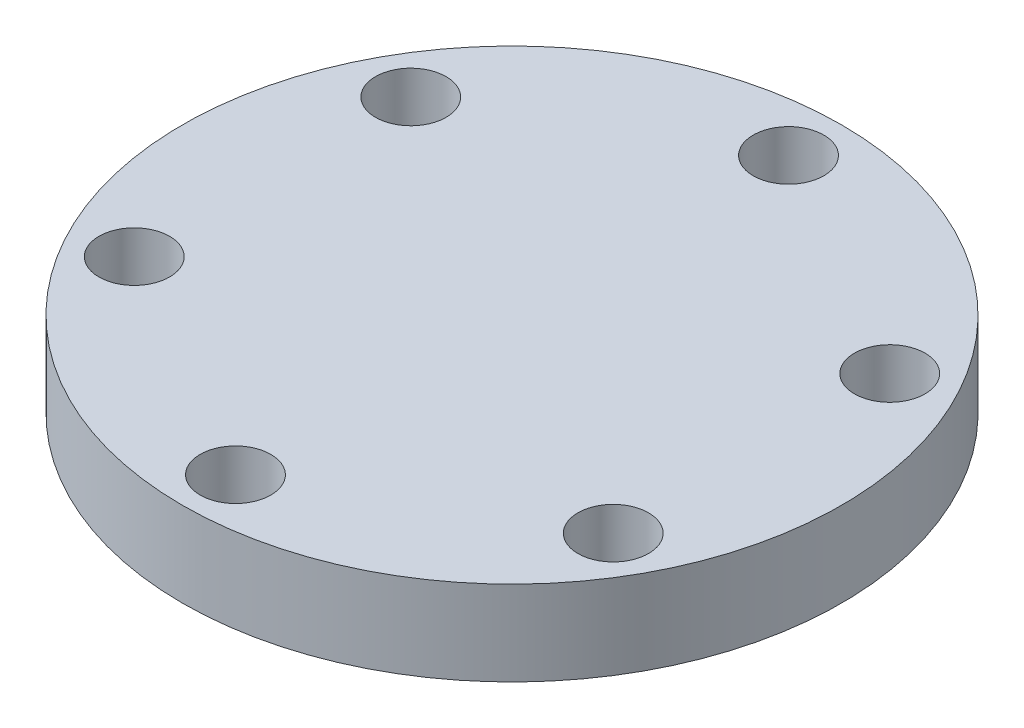
ISO-10303-21;
HEADER;
FILE_DESCRIPTION(('STEP AP214'),'2;1');
FILE_NAME('part.step','',(''),(''),'','','');
FILE_SCHEMA(('AUTOMOTIVE_DESIGN { 1 0 10303 214 1 1 1 1 }'));
ENDSEC;
DATA;
#1=APPLICATION_CONTEXT('core data for automotive mechanical design processes');
#2=APPLICATION_PROTOCOL_DEFINITION('international standard','automotive_design',2000,#1);
#3=PRODUCT_CONTEXT('',#1,'mechanical');
#4=PRODUCT('Part','Part','',(#3));
#5=PRODUCT_RELATED_PRODUCT_CATEGORY('part','',(#4));
#6=PRODUCT_DEFINITION_FORMATION('','',#4);
#7=PRODUCT_DEFINITION_CONTEXT('part definition',#1,'design');
#8=PRODUCT_DEFINITION('design','',#6,#7);
#9=PRODUCT_DEFINITION_SHAPE('','',#8);
#10=(LENGTH_UNIT() NAMED_UNIT(*) SI_UNIT(.MILLI.,.METRE.));
#11=(NAMED_UNIT(*) PLANE_ANGLE_UNIT() SI_UNIT($,.RADIAN.));
#12=(NAMED_UNIT(*) SI_UNIT($,.STERADIAN.) SOLID_ANGLE_UNIT());
#13=UNCERTAINTY_MEASURE_WITH_UNIT(LENGTH_MEASURE(1.E-05),#10,'distance_accuracy_value','');
#14=(GEOMETRIC_REPRESENTATION_CONTEXT(3) GLOBAL_UNCERTAINTY_ASSIGNED_CONTEXT((#13)) GLOBAL_UNIT_ASSIGNED_CONTEXT((#10,
#11,#12)) REPRESENTATION_CONTEXT('',''));
#15=CARTESIAN_POINT('',(0.,0.,0.));
#16=DIRECTION('',(0.,0.,1.));
#17=DIRECTION('',(1.,0.,0.));
#18=AXIS2_PLACEMENT_3D('',#15,#16,#17);
#19=CARTESIAN_POINT('',(0.,1.8,0.));
#20=DIRECTION('',(0.,-1.,0.));
#21=DIRECTION('',(0.,0.,-1.));
#22=AXIS2_PLACEMENT_3D('',#19,#20,#21);
#23=CYLINDRICAL_SURFACE('',#22,7.);
#24=CARTESIAN_POINT('',(0.,1.8,0.));
#25=DIRECTION('',(0.,1.,0.));
#26=DIRECTION('',(0.,0.,1.));
#27=AXIS2_PLACEMENT_3D('',#24,#25,#26);
#28=CIRCLE('',#27,7.);
#29=CARTESIAN_POINT('',(0.,1.8,7.));
#30=VERTEX_POINT('',#29);
#31=EDGE_CURVE('E10',#30,#30,#28,.T.);
#32=ORIENTED_EDGE('',*,*,#31,.F.);
#33=EDGE_LOOP('',(#32));
#34=FACE_BOUND('',#33,.T.);
#35=CARTESIAN_POINT('',(0.,0.,0.));
#36=DIRECTION('',(0.,1.,0.));
#37=DIRECTION('',(0.,0.,1.));
#38=AXIS2_PLACEMENT_3D('',#35,#36,#37);
#39=CIRCLE('',#38,7.);
#40=CARTESIAN_POINT('',(0.,0.,7.));
#41=VERTEX_POINT('',#40);
#42=EDGE_CURVE('E34',#41,#41,#39,.T.);
#43=ORIENTED_EDGE('',*,*,#42,.T.);
#44=EDGE_LOOP('',(#43));
#45=FACE_BOUND('',#44,.T.);
#46=ADVANCED_FACE('F31',(#34,#45),#23,.T.);
#47=CARTESIAN_POINT('',(0.,1.8,0.));
#48=DIRECTION('',(0.,1.,0.));
#49=DIRECTION('',(0.,0.,1.));
#50=AXIS2_PLACEMENT_3D('',#47,#48,#49);
#51=PLANE('',#50);
#52=CARTESIAN_POINT('',(-5.08678902100646,1.8,2.93685901058899));
#53=DIRECTION('',(0.,-1.,0.));
#54=DIRECTION('',(0.866025403784433,0.,-0.50000000000001));
#55=AXIS2_PLACEMENT_3D('',#52,#53,#54);
#56=CIRCLE('',#55,0.75);
#57=CARTESIAN_POINT('',(-4.43726996816814,1.8,2.56185901058898));
#58=VERTEX_POINT('',#57);
#59=EDGE_CURVE('E70',#58,#58,#56,.T.);
#60=ORIENTED_EDGE('',*,*,#59,.T.);
#61=EDGE_LOOP('',(#60));
#62=FACE_BOUND('',#61,.T.);
#63=CARTESIAN_POINT('',(-5.08678902100652,1.8,-2.93685901058889));
#64=DIRECTION('',(0.,-1.,0.));
#65=DIRECTION('',(0.866025403784443,0.,0.499999999999992));
#66=AXIS2_PLACEMENT_3D('',#63,#64,#65);
#67=CIRCLE('',#66,0.75);
#68=CARTESIAN_POINT('',(-4.43726996816819,1.8,-2.56185901058889));
#69=VERTEX_POINT('',#68);
#70=EDGE_CURVE('E64',#69,#69,#67,.T.);
#71=ORIENTED_EDGE('',*,*,#70,.T.);
#72=EDGE_LOOP('',(#71));
#73=FACE_BOUND('',#72,.T.);
#74=CARTESIAN_POINT('',(0.,1.8,-5.87371802117787));
#75=DIRECTION('',(0.,-1.,0.));
#76=DIRECTION('',(0.,0.,1.));
#77=AXIS2_PLACEMENT_3D('',#74,#75,#76);
#78=CIRCLE('',#77,0.75);
#79=CARTESIAN_POINT('',(0.,1.8,-5.12371802117787));
#80=VERTEX_POINT('',#79);
#81=EDGE_CURVE('E58',#80,#80,#78,.T.);
#82=ORIENTED_EDGE('',*,*,#81,.T.);
#83=EDGE_LOOP('',(#82));
#84=FACE_BOUND('',#83,.T.);
#85=CARTESIAN_POINT('',(5.08678902100648,1.8,-2.93685901058896));
#86=DIRECTION('',(0.,-1.,0.));
#87=DIRECTION('',(-0.866025403784436,0.,0.500000000000004));
#88=AXIS2_PLACEMENT_3D('',#85,#86,#87);
#89=CIRCLE('',#88,0.75);
#90=CARTESIAN_POINT('',(4.43726996816815,1.8,-2.56185901058895));
#91=VERTEX_POINT('',#90);
#92=EDGE_CURVE('E52',#91,#91,#89,.T.);
#93=ORIENTED_EDGE('',*,*,#92,.T.);
#94=EDGE_LOOP('',(#93));
#95=FACE_BOUND('',#94,.T.);
#96=CARTESIAN_POINT('',(5.0867890210065,1.8,2.93685901058892));
#97=DIRECTION('',(0.,-1.,0.));
#98=DIRECTION('',(-0.86602540378444,0.,-0.499999999999998));
#99=AXIS2_PLACEMENT_3D('',#96,#97,#98);
#100=CIRCLE('',#99,0.75);
#101=CARTESIAN_POINT('',(4.43726996816817,1.8,2.56185901058892));
#102=VERTEX_POINT('',#101);
#103=EDGE_CURVE('E46',#102,#102,#100,.T.);
#104=ORIENTED_EDGE('',*,*,#103,.T.);
#105=EDGE_LOOP('',(#104));
#106=FACE_BOUND('',#105,.T.);
#107=CARTESIAN_POINT('',(0.,1.8,5.87371802117787));
#108=DIRECTION('',(0.,-1.,0.));
#109=DIRECTION('',(0.,0.,-1.));
#110=AXIS2_PLACEMENT_3D('',#107,#108,#109);
#111=CIRCLE('',#110,0.75);
#112=CARTESIAN_POINT('',(0.,1.8,5.12371802117787));
#113=VERTEX_POINT('',#112);
#114=EDGE_CURVE('E41',#113,#113,#111,.T.);
#115=ORIENTED_EDGE('',*,*,#114,.T.);
#116=EDGE_LOOP('',(#115));
#117=FACE_BOUND('',#116,.T.);
#118=ORIENTED_EDGE('',*,*,#31,.T.);
#119=EDGE_LOOP('',(#118));
#120=FACE_BOUND('',#119,.T.);
#121=ADVANCED_FACE('F79',(#62,#73,#84,#95,#106,#117,#120),#51,.T.);
#122=CARTESIAN_POINT('',(0.,0.,0.));
#123=DIRECTION('',(0.,1.,0.));
#124=DIRECTION('',(0.,0.,1.));
#125=AXIS2_PLACEMENT_3D('',#122,#123,#124);
#126=PLANE('',#125);
#127=CARTESIAN_POINT('',(-5.08678902100646,0.,2.93685901058899));
#128=DIRECTION('',(0.,-1.,0.));
#129=DIRECTION('',(0.866025403784433,0.,-0.50000000000001));
#130=AXIS2_PLACEMENT_3D('',#127,#128,#129);
#131=CIRCLE('',#130,0.75);
#132=CARTESIAN_POINT('',(-4.43726996816814,0.,2.56185901058898));
#133=VERTEX_POINT('',#132);
#134=EDGE_CURVE('E73',#133,#133,#131,.T.);
#135=ORIENTED_EDGE('',*,*,#134,.F.);
#136=EDGE_LOOP('',(#135));
#137=FACE_BOUND('',#136,.T.);
#138=CARTESIAN_POINT('',(-5.08678902100652,0.,-2.93685901058889));
#139=DIRECTION('',(0.,-1.,0.));
#140=DIRECTION('',(0.866025403784443,0.,0.499999999999992));
#141=AXIS2_PLACEMENT_3D('',#138,#139,#140);
#142=CIRCLE('',#141,0.75);
#143=CARTESIAN_POINT('',(-4.43726996816819,0.,-2.56185901058889));
#144=VERTEX_POINT('',#143);
#145=EDGE_CURVE('E67',#144,#144,#142,.T.);
#146=ORIENTED_EDGE('',*,*,#145,.F.);
#147=EDGE_LOOP('',(#146));
#148=FACE_BOUND('',#147,.T.);
#149=CARTESIAN_POINT('',(0.,0.,-5.87371802117787));
#150=DIRECTION('',(0.,-1.,0.));
#151=DIRECTION('',(0.,0.,1.));
#152=AXIS2_PLACEMENT_3D('',#149,#150,#151);
#153=CIRCLE('',#152,0.75);
#154=CARTESIAN_POINT('',(0.,0.,-5.12371802117787));
#155=VERTEX_POINT('',#154);
#156=EDGE_CURVE('E61',#155,#155,#153,.T.);
#157=ORIENTED_EDGE('',*,*,#156,.F.);
#158=EDGE_LOOP('',(#157));
#159=FACE_BOUND('',#158,.T.);
#160=CARTESIAN_POINT('',(5.08678902100648,0.,-2.93685901058896));
#161=DIRECTION('',(0.,-1.,0.));
#162=DIRECTION('',(-0.866025403784436,0.,0.500000000000004));
#163=AXIS2_PLACEMENT_3D('',#160,#161,#162);
#164=CIRCLE('',#163,0.75);
#165=CARTESIAN_POINT('',(4.43726996816815,0.,-2.56185901058895));
#166=VERTEX_POINT('',#165);
#167=EDGE_CURVE('E55',#166,#166,#164,.T.);
#168=ORIENTED_EDGE('',*,*,#167,.F.);
#169=EDGE_LOOP('',(#168));
#170=FACE_BOUND('',#169,.T.);
#171=CARTESIAN_POINT('',(5.0867890210065,0.,2.93685901058892));
#172=DIRECTION('',(0.,-1.,0.));
#173=DIRECTION('',(-0.86602540378444,0.,-0.499999999999998));
#174=AXIS2_PLACEMENT_3D('',#171,#172,#173);
#175=CIRCLE('',#174,0.75);
#176=CARTESIAN_POINT('',(4.43726996816817,0.,2.56185901058892));
#177=VERTEX_POINT('',#176);
#178=EDGE_CURVE('E49',#177,#177,#175,.T.);
#179=ORIENTED_EDGE('',*,*,#178,.F.);
#180=EDGE_LOOP('',(#179));
#181=FACE_BOUND('',#180,.T.);
#182=CARTESIAN_POINT('',(0.,0.,5.87371802117787));
#183=DIRECTION('',(0.,-1.,0.));
#184=DIRECTION('',(0.,0.,-1.));
#185=AXIS2_PLACEMENT_3D('',#182,#183,#184);
#186=CIRCLE('',#185,0.75);
#187=CARTESIAN_POINT('',(0.,0.,5.12371802117787));
#188=VERTEX_POINT('',#187);
#189=EDGE_CURVE('E43',#188,#188,#186,.T.);
#190=ORIENTED_EDGE('',*,*,#189,.F.);
#191=EDGE_LOOP('',(#190));
#192=FACE_BOUND('',#191,.T.);
#193=ORIENTED_EDGE('',*,*,#42,.F.);
#194=EDGE_LOOP('',(#193));
#195=FACE_BOUND('',#194,.T.);
#196=ADVANCED_FACE('F89',(#137,#148,#159,#170,#181,#192,#195),#126,.F.);
#197=CARTESIAN_POINT('',(0.,1.8,5.87371802117787));
#198=DIRECTION('',(0.,-1.,0.));
#199=DIRECTION('',(0.,0.,-1.));
#200=AXIS2_PLACEMENT_3D('',#197,#198,#199);
#201=CYLINDRICAL_SURFACE('',#200,0.75);
#202=ORIENTED_EDGE('',*,*,#114,.F.);
#203=EDGE_LOOP('',(#202));
#204=FACE_BOUND('',#203,.T.);
#205=ORIENTED_EDGE('',*,*,#189,.T.);
#206=EDGE_LOOP('',(#205));
#207=FACE_BOUND('',#206,.T.);
#208=ADVANCED_FACE('F92',(#204,#207),#201,.F.);
#209=CARTESIAN_POINT('',(5.0867890210065,1.8,2.93685901058892));
#210=DIRECTION('',(0.,-1.,0.));
#211=DIRECTION('',(0.,0.,-1.));
#212=AXIS2_PLACEMENT_3D('',#209,#210,#211);
#213=CYLINDRICAL_SURFACE('',#212,0.75);
#214=ORIENTED_EDGE('',*,*,#103,.F.);
#215=EDGE_LOOP('',(#214));
#216=FACE_BOUND('',#215,.T.);
#217=ORIENTED_EDGE('',*,*,#178,.T.);
#218=EDGE_LOOP('',(#217));
#219=FACE_BOUND('',#218,.T.);
#220=ADVANCED_FACE('F116',(#216,#219),#213,.F.);
#221=CARTESIAN_POINT('',(5.08678902100648,1.8,-2.93685901058896));
#222=DIRECTION('',(0.,-1.,0.));
#223=DIRECTION('',(0.,0.,-1.));
#224=AXIS2_PLACEMENT_3D('',#221,#222,#223);
#225=CYLINDRICAL_SURFACE('',#224,0.75);
#226=ORIENTED_EDGE('',*,*,#92,.F.);
#227=EDGE_LOOP('',(#226));
#228=FACE_BOUND('',#227,.T.);
#229=ORIENTED_EDGE('',*,*,#167,.T.);
#230=EDGE_LOOP('',(#229));
#231=FACE_BOUND('',#230,.T.);
#232=ADVANCED_FACE('F120',(#228,#231),#225,.F.);
#233=CARTESIAN_POINT('',(0.,1.8,-5.87371802117787));
#234=DIRECTION('',(0.,-1.,0.));
#235=DIRECTION('',(0.,0.,-1.));
#236=AXIS2_PLACEMENT_3D('',#233,#234,#235);
#237=CYLINDRICAL_SURFACE('',#236,0.75);
#238=ORIENTED_EDGE('',*,*,#81,.F.);
#239=EDGE_LOOP('',(#238));
#240=FACE_BOUND('',#239,.T.);
#241=ORIENTED_EDGE('',*,*,#156,.T.);
#242=EDGE_LOOP('',(#241));
#243=FACE_BOUND('',#242,.T.);
#244=ADVANCED_FACE('F124',(#240,#243),#237,.F.);
#245=CARTESIAN_POINT('',(-5.08678902100652,1.8,-2.93685901058889));
#246=DIRECTION('',(0.,-1.,0.));
#247=DIRECTION('',(0.,0.,-1.));
#248=AXIS2_PLACEMENT_3D('',#245,#246,#247);
#249=CYLINDRICAL_SURFACE('',#248,0.75);
#250=ORIENTED_EDGE('',*,*,#70,.F.);
#251=EDGE_LOOP('',(#250));
#252=FACE_BOUND('',#251,.T.);
#253=ORIENTED_EDGE('',*,*,#145,.T.);
#254=EDGE_LOOP('',(#253));
#255=FACE_BOUND('',#254,.T.);
#256=ADVANCED_FACE('F85',(#252,#255),#249,.F.);
#257=CARTESIAN_POINT('',(-5.08678902100646,1.8,2.93685901058899));
#258=DIRECTION('',(0.,-1.,0.));
#259=DIRECTION('',(0.,0.,-1.));
#260=AXIS2_PLACEMENT_3D('',#257,#258,#259);
#261=CYLINDRICAL_SURFACE('',#260,0.75);
#262=ORIENTED_EDGE('',*,*,#59,.F.);
#263=EDGE_LOOP('',(#262));
#264=FACE_BOUND('',#263,.T.);
#265=ORIENTED_EDGE('',*,*,#134,.T.);
#266=EDGE_LOOP('',(#265));
#267=FACE_BOUND('',#266,.T.);
#268=ADVANCED_FACE('F82',(#264,#267),#261,.F.);
#269=CLOSED_SHELL('',(#46,#121,#196,#208,#220,#232,#244,#256,#268));
#270=MANIFOLD_SOLID_BREP('B2',#269);
#271=ADVANCED_BREP_SHAPE_REPRESENTATION('',(#18,#270),#14);
#272=SHAPE_DEFINITION_REPRESENTATION(#9,#271);
ENDSEC;
END-ISO-10303-21;
